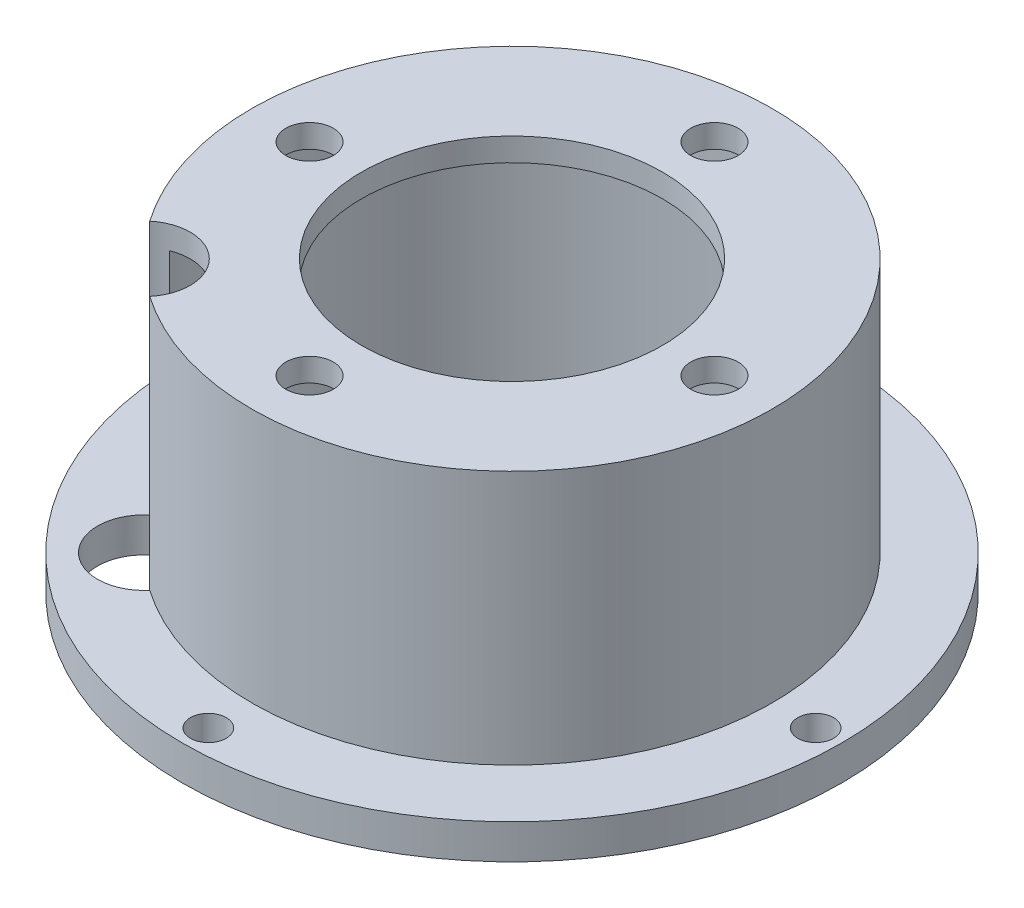
ISO-10303-21;
HEADER;
FILE_DESCRIPTION(('STEP AP214'),'2;1');
FILE_NAME('part.step','',(''),(''),'','','');
FILE_SCHEMA(('AUTOMOTIVE_DESIGN { 1 0 10303 214 1 1 1 1 }'));
ENDSEC;
DATA;
#1=APPLICATION_CONTEXT('core data for automotive mechanical design processes');
#2=APPLICATION_PROTOCOL_DEFINITION('international standard','automotive_design',2000,#1);
#3=PRODUCT_CONTEXT('',#1,'mechanical');
#4=PRODUCT('Part','Part','',(#3));
#5=PRODUCT_RELATED_PRODUCT_CATEGORY('part','',(#4));
#6=PRODUCT_DEFINITION_FORMATION('','',#4);
#7=PRODUCT_DEFINITION_CONTEXT('part definition',#1,'design');
#8=PRODUCT_DEFINITION('design','',#6,#7);
#9=PRODUCT_DEFINITION_SHAPE('','',#8);
#10=(LENGTH_UNIT() NAMED_UNIT(*) SI_UNIT(.MILLI.,.METRE.));
#11=(NAMED_UNIT(*) PLANE_ANGLE_UNIT() SI_UNIT($,.RADIAN.));
#12=(NAMED_UNIT(*) SI_UNIT($,.STERADIAN.) SOLID_ANGLE_UNIT());
#13=UNCERTAINTY_MEASURE_WITH_UNIT(LENGTH_MEASURE(1.E-05),#10,'distance_accuracy_value','');
#14=(GEOMETRIC_REPRESENTATION_CONTEXT(3) GLOBAL_UNCERTAINTY_ASSIGNED_CONTEXT((#13)) GLOBAL_UNIT_ASSIGNED_CONTEXT((#10,
#11,#12)) REPRESENTATION_CONTEXT('',''));
#15=CARTESIAN_POINT('',(0.,0.,0.));
#16=DIRECTION('',(0.,0.,1.));
#17=DIRECTION('',(1.,0.,0.));
#18=AXIS2_PLACEMENT_3D('',#15,#16,#17);
#19=CARTESIAN_POINT('',(0.,25.,-22.5));
#20=DIRECTION('',(0.,1.,0.));
#21=DIRECTION('',(0.,0.,1.));
#22=AXIS2_PLACEMENT_3D('',#19,#20,#21);
#23=PLANE('',#22);
#24=CARTESIAN_POINT('',(-15.9099025766973,25.,15.9099025766973));
#25=DIRECTION('',(0.,1.,0.));
#26=DIRECTION('',(0.,0.,1.));
#27=AXIS2_PLACEMENT_3D('',#24,#25,#26);
#28=CIRCLE('',#27,4.);
#29=CARTESIAN_POINT('',(-12.8412559004105,25.,18.4757177641404));
#30=VERTEX_POINT('',#29);
#31=CARTESIAN_POINT('',(-18.4757177641404,25.,12.8412559004105));
#32=VERTEX_POINT('',#31);
#33=EDGE_CURVE('E76',#30,#32,#28,.T.);
#34=ORIENTED_EDGE('',*,*,#33,.F.);
#35=CARTESIAN_POINT('',(0.,25.,0.));
#36=DIRECTION('',(0.,-1.,0.));
#37=DIRECTION('',(0.,0.,-1.));
#38=AXIS2_PLACEMENT_3D('',#35,#36,#37);
#39=CIRCLE('',#38,22.5);
#40=EDGE_CURVE('E88',#32,#30,#39,.T.);
#41=ORIENTED_EDGE('',*,*,#40,.F.);
#42=EDGE_LOOP('',(#34,#41));
#43=FACE_BOUND('',#42,.T.);
#44=CARTESIAN_POINT('',(0.,25.,-17.5000000000001));
#45=DIRECTION('',(0.,1.,0.));
#46=DIRECTION('',(0.,0.,1.));
#47=AXIS2_PLACEMENT_3D('',#44,#45,#46);
#48=CIRCLE('',#47,2.05);
#49=CARTESIAN_POINT('',(0.,25.,-15.4500000000001));
#50=VERTEX_POINT('',#49);
#51=EDGE_CURVE('E124',#50,#50,#48,.T.);
#52=ORIENTED_EDGE('',*,*,#51,.F.);
#53=EDGE_LOOP('',(#52));
#54=FACE_BOUND('',#53,.T.);
#55=CARTESIAN_POINT('',(17.5,25.,0.));
#56=DIRECTION('',(0.,1.,0.));
#57=DIRECTION('',(0.,0.,1.));
#58=AXIS2_PLACEMENT_3D('',#55,#56,#57);
#59=CIRCLE('',#58,2.05);
#60=CARTESIAN_POINT('',(17.5,25.,2.05));
#61=VERTEX_POINT('',#60);
#62=EDGE_CURVE('E149',#61,#61,#59,.T.);
#63=ORIENTED_EDGE('',*,*,#62,.F.);
#64=EDGE_LOOP('',(#63));
#65=FACE_BOUND('',#64,.T.);
#66=CARTESIAN_POINT('',(0.,25.,17.5));
#67=DIRECTION('',(0.,1.,0.));
#68=DIRECTION('',(0.,0.,1.));
#69=AXIS2_PLACEMENT_3D('',#66,#67,#68);
#70=CIRCLE('',#69,2.05);
#71=CARTESIAN_POINT('',(0.,25.,19.55));
#72=VERTEX_POINT('',#71);
#73=EDGE_CURVE('E141',#72,#72,#70,.T.);
#74=ORIENTED_EDGE('',*,*,#73,.F.);
#75=EDGE_LOOP('',(#74));
#76=FACE_BOUND('',#75,.T.);
#77=CARTESIAN_POINT('',(-17.5000000000001,25.,0.));
#78=DIRECTION('',(0.,1.,0.));
#79=DIRECTION('',(0.,0.,1.));
#80=AXIS2_PLACEMENT_3D('',#77,#78,#79);
#81=CIRCLE('',#80,2.05);
#82=CARTESIAN_POINT('',(-17.5000000000001,25.,2.05));
#83=VERTEX_POINT('',#82);
#84=EDGE_CURVE('E99',#83,#83,#81,.T.);
#85=ORIENTED_EDGE('',*,*,#84,.F.);
#86=EDGE_LOOP('',(#85));
#87=FACE_BOUND('',#86,.T.);
#88=CARTESIAN_POINT('',(0.,25.,0.));
#89=DIRECTION('',(0.,-1.,0.));
#90=DIRECTION('',(0.,0.,-1.));
#91=AXIS2_PLACEMENT_3D('',#88,#89,#90);
#92=CIRCLE('',#91,13.);
#93=CARTESIAN_POINT('',(0.,25.,-13.));
#94=VERTEX_POINT('',#93);
#95=EDGE_CURVE('E85',#94,#94,#92,.T.);
#96=ORIENTED_EDGE('',*,*,#95,.T.);
#97=EDGE_LOOP('',(#96));
#98=FACE_BOUND('',#97,.T.);
#99=ADVANCED_FACE('F37',(#43,#54,#65,#76,#87,#98),#23,.T.);
#100=CARTESIAN_POINT('',(0.,0.,0.));
#101=DIRECTION('',(0.,-1.,0.));
#102=DIRECTION('',(0.,0.,-1.));
#103=AXIS2_PLACEMENT_3D('',#100,#101,#102);
#104=CYLINDRICAL_SURFACE('',#103,13.);
#105=CARTESIAN_POINT('',(0.,23.,0.));
#106=DIRECTION('',(0.,-1.,0.));
#107=DIRECTION('',(0.,0.,-1.));
#108=AXIS2_PLACEMENT_3D('',#105,#106,#107);
#109=CIRCLE('',#108,13.);
#110=CARTESIAN_POINT('',(0.,23.,-13.));
#111=VERTEX_POINT('',#110);
#112=EDGE_CURVE('E112',#111,#111,#109,.T.);
#113=ORIENTED_EDGE('',*,*,#112,.T.);
#114=EDGE_LOOP('',(#113));
#115=FACE_BOUND('',#114,.T.);
#116=ORIENTED_EDGE('',*,*,#95,.F.);
#117=EDGE_LOOP('',(#116));
#118=FACE_BOUND('',#117,.T.);
#119=ADVANCED_FACE('F210',(#115,#118),#104,.F.);
#120=CARTESIAN_POINT('',(0.,23.,-13.));
#121=DIRECTION('',(0.,-1.,0.));
#122=DIRECTION('',(0.,0.,-1.));
#123=AXIS2_PLACEMENT_3D('',#120,#121,#122);
#124=PLANE('',#123);
#125=CARTESIAN_POINT('',(-15.9099025766973,23.,15.9099025766973));
#126=DIRECTION('',(0.,-1.,0.));
#127=DIRECTION('',(0.,0.,-1.));
#128=AXIS2_PLACEMENT_3D('',#125,#126,#127);
#129=CIRCLE('',#128,4.);
#130=CARTESIAN_POINT('',(-17.4003556514104,23.,12.1979556977565));
#131=VERTEX_POINT('',#130);
#132=CARTESIAN_POINT('',(-12.1979556977565,23.,17.4003556514104));
#133=VERTEX_POINT('',#132);
#134=EDGE_CURVE('E158',#131,#133,#129,.T.);
#135=ORIENTED_EDGE('',*,*,#134,.F.);
#136=CARTESIAN_POINT('',(0.,23.,0.));
#137=DIRECTION('',(0.,-1.,0.));
#138=DIRECTION('',(0.,0.,-1.));
#139=AXIS2_PLACEMENT_3D('',#136,#137,#138);
#140=CIRCLE('',#139,21.25);
#141=EDGE_CURVE('E111',#131,#133,#140,.T.);
#142=ORIENTED_EDGE('',*,*,#141,.T.);
#143=EDGE_LOOP('',(#135,#142));
#144=FACE_BOUND('',#143,.T.);
#145=CARTESIAN_POINT('',(0.,23.,-17.5000000000001));
#146=DIRECTION('',(0.,-1.,0.));
#147=DIRECTION('',(0.,0.,-1.));
#148=AXIS2_PLACEMENT_3D('',#145,#146,#147);
#149=CIRCLE('',#148,2.05);
#150=CARTESIAN_POINT('',(0.,23.,-19.5500000000001));
#151=VERTEX_POINT('',#150);
#152=EDGE_CURVE('E91',#151,#151,#149,.T.);
#153=ORIENTED_EDGE('',*,*,#152,.F.);
#154=EDGE_LOOP('',(#153));
#155=FACE_BOUND('',#154,.T.);
#156=CARTESIAN_POINT('',(17.5,23.,0.));
#157=DIRECTION('',(0.,-1.,0.));
#158=DIRECTION('',(0.,0.,-1.));
#159=AXIS2_PLACEMENT_3D('',#156,#157,#158);
#160=CIRCLE('',#159,2.05);
#161=CARTESIAN_POINT('',(17.5,23.,-2.05));
#162=VERTEX_POINT('',#161);
#163=EDGE_CURVE('E97',#162,#162,#160,.T.);
#164=ORIENTED_EDGE('',*,*,#163,.F.);
#165=EDGE_LOOP('',(#164));
#166=FACE_BOUND('',#165,.T.);
#167=CARTESIAN_POINT('',(0.,23.,17.5));
#168=DIRECTION('',(0.,-1.,0.));
#169=DIRECTION('',(0.,0.,-1.));
#170=AXIS2_PLACEMENT_3D('',#167,#168,#169);
#171=CIRCLE('',#170,2.05);
#172=CARTESIAN_POINT('',(0.,23.,15.45));
#173=VERTEX_POINT('',#172);
#174=EDGE_CURVE('E125',#173,#173,#171,.T.);
#175=ORIENTED_EDGE('',*,*,#174,.F.);
#176=EDGE_LOOP('',(#175));
#177=FACE_BOUND('',#176,.T.);
#178=CARTESIAN_POINT('',(-17.5000000000001,23.,0.));
#179=DIRECTION('',(0.,-1.,0.));
#180=DIRECTION('',(0.,0.,-1.));
#181=AXIS2_PLACEMENT_3D('',#178,#179,#180);
#182=CIRCLE('',#181,2.05);
#183=CARTESIAN_POINT('',(-17.5000000000001,23.,-2.05));
#184=VERTEX_POINT('',#183);
#185=EDGE_CURVE('E118',#184,#184,#182,.T.);
#186=ORIENTED_EDGE('',*,*,#185,.F.);
#187=EDGE_LOOP('',(#186));
#188=FACE_BOUND('',#187,.T.);
#189=ORIENTED_EDGE('',*,*,#112,.F.);
#190=EDGE_LOOP('',(#189));
#191=FACE_BOUND('',#190,.T.);
#192=ADVANCED_FACE('F214',(#144,#155,#166,#177,#188,#191),#124,.T.);
#193=CARTESIAN_POINT('',(0.,0.,0.));
#194=DIRECTION('',(0.,-1.,0.));
#195=DIRECTION('',(0.,0.,-1.));
#196=AXIS2_PLACEMENT_3D('',#193,#194,#195);
#197=CYLINDRICAL_SURFACE('',#196,21.25);
#198=DIRECTION('',(0.,1.,0.));
#199=VECTOR('',#198,1.);
#200=CARTESIAN_POINT('',(-17.4003556514104,10.5,12.1979556977565));
#201=LINE('',#200,#199);
#202=CARTESIAN_POINT('',(-17.4003556514104,0.,12.1979556977565));
#203=VERTEX_POINT('',#202);
#204=EDGE_CURVE('E166',#203,#131,#201,.T.);
#205=ORIENTED_EDGE('',*,*,#204,.F.);
#206=CARTESIAN_POINT('',(0.,0.,0.));
#207=DIRECTION('',(0.,-1.,0.));
#208=DIRECTION('',(0.,0.,-1.));
#209=AXIS2_PLACEMENT_3D('',#206,#207,#208);
#210=CIRCLE('',#209,21.25);
#211=CARTESIAN_POINT('',(-12.1979556977565,0.,17.4003556514104));
#212=VERTEX_POINT('',#211);
#213=EDGE_CURVE('E108',#203,#212,#210,.T.);
#214=ORIENTED_EDGE('',*,*,#213,.T.);
#215=DIRECTION('',(0.,1.,0.));
#216=VECTOR('',#215,1.);
#217=CARTESIAN_POINT('',(-12.1979556977565,10.5,17.4003556514104));
#218=LINE('',#217,#216);
#219=EDGE_CURVE('E53',#133,#212,#218,.F.);
#220=ORIENTED_EDGE('',*,*,#219,.F.);
#221=ORIENTED_EDGE('',*,*,#141,.F.);
#222=EDGE_LOOP('',(#205,#214,#220,#221));
#223=FACE_BOUND('',#222,.T.);
#224=ADVANCED_FACE('F177',(#223),#197,.F.);
#225=CARTESIAN_POINT('',(0.,0.,-21.25));
#226=DIRECTION('',(0.,-1.,0.));
#227=DIRECTION('',(0.,0.,-1.));
#228=AXIS2_PLACEMENT_3D('',#225,#226,#227);
#229=PLANE('',#228);
#230=CARTESIAN_POINT('',(-15.9099025766973,0.,15.9099025766973));
#231=DIRECTION('',(0.,-1.,0.));
#232=DIRECTION('',(0.,0.,-1.));
#233=AXIS2_PLACEMENT_3D('',#230,#231,#232);
#234=CIRCLE('',#233,4.);
#235=EDGE_CURVE('E171',#212,#203,#234,.T.);
#236=ORIENTED_EDGE('',*,*,#235,.F.);
#237=ORIENTED_EDGE('',*,*,#213,.F.);
#238=EDGE_LOOP('',(#236,#237));
#239=FACE_BOUND('',#238,.T.);
#240=CARTESIAN_POINT('',(0.,0.,26.25));
#241=DIRECTION('',(0.,1.,0.));
#242=DIRECTION('',(0.,0.,1.));
#243=AXIS2_PLACEMENT_3D('',#240,#241,#242);
#244=CIRCLE('',#243,1.55);
#245=CARTESIAN_POINT('',(0.,0.,27.8));
#246=VERTEX_POINT('',#245);
#247=EDGE_CURVE('E135',#246,#246,#244,.T.);
#248=ORIENTED_EDGE('',*,*,#247,.T.);
#249=EDGE_LOOP('',(#248));
#250=FACE_BOUND('',#249,.T.);
#251=CARTESIAN_POINT('',(-26.25,0.,0.));
#252=DIRECTION('',(0.,1.,0.));
#253=DIRECTION('',(0.,0.,1.));
#254=AXIS2_PLACEMENT_3D('',#251,#252,#253);
#255=CIRCLE('',#254,1.55);
#256=CARTESIAN_POINT('',(-26.25,0.,1.54999999999991));
#257=VERTEX_POINT('',#256);
#258=EDGE_CURVE('E162',#257,#257,#255,.T.);
#259=ORIENTED_EDGE('',*,*,#258,.T.);
#260=EDGE_LOOP('',(#259));
#261=FACE_BOUND('',#260,.T.);
#262=CARTESIAN_POINT('',(1.83302770289264E-13,0.,-26.25));
#263=DIRECTION('',(0.,1.,0.));
#264=DIRECTION('',(0.,0.,1.));
#265=AXIS2_PLACEMENT_3D('',#262,#263,#264);
#266=CIRCLE('',#265,1.55);
#267=CARTESIAN_POINT('',(1.83302770289264E-13,0.,-24.7));
#268=VERTEX_POINT('',#267);
#269=EDGE_CURVE('E160',#268,#268,#266,.T.);
#270=ORIENTED_EDGE('',*,*,#269,.T.);
#271=EDGE_LOOP('',(#270));
#272=FACE_BOUND('',#271,.T.);
#273=CARTESIAN_POINT('',(26.25,0.,2.74954155433897E-13));
#274=DIRECTION('',(0.,1.,0.));
#275=DIRECTION('',(0.,0.,1.));
#276=AXIS2_PLACEMENT_3D('',#273,#274,#275);
#277=CIRCLE('',#276,1.55);
#278=CARTESIAN_POINT('',(26.25,0.,1.55000000000028));
#279=VERTEX_POINT('',#278);
#280=EDGE_CURVE('E154',#279,#279,#277,.T.);
#281=ORIENTED_EDGE('',*,*,#280,.T.);
#282=EDGE_LOOP('',(#281));
#283=FACE_BOUND('',#282,.T.);
#284=CARTESIAN_POINT('',(0.,0.,0.));
#285=DIRECTION('',(0.,-1.,0.));
#286=DIRECTION('',(0.,0.,-1.));
#287=AXIS2_PLACEMENT_3D('',#284,#285,#286);
#288=CIRCLE('',#287,28.5);
#289=CARTESIAN_POINT('',(0.,0.,-28.5));
#290=VERTEX_POINT('',#289);
#291=EDGE_CURVE('E102',#290,#290,#288,.T.);
#292=ORIENTED_EDGE('',*,*,#291,.T.);
#293=EDGE_LOOP('',(#292));
#294=FACE_BOUND('',#293,.T.);
#295=ADVANCED_FACE('F179',(#239,#250,#261,#272,#283,#294),#229,.T.);
#296=CARTESIAN_POINT('',(0.,0.,0.));
#297=DIRECTION('',(0.,-1.,0.));
#298=DIRECTION('',(0.,0.,-1.));
#299=AXIS2_PLACEMENT_3D('',#296,#297,#298);
#300=CYLINDRICAL_SURFACE('',#299,28.5);
#301=CARTESIAN_POINT('',(0.,3.,0.));
#302=DIRECTION('',(0.,-1.,0.));
#303=DIRECTION('',(0.,0.,-1.));
#304=AXIS2_PLACEMENT_3D('',#301,#302,#303);
#305=CIRCLE('',#304,28.5);
#306=CARTESIAN_POINT('',(0.,3.,-28.5));
#307=VERTEX_POINT('',#306);
#308=EDGE_CURVE('E93',#307,#307,#305,.T.);
#309=ORIENTED_EDGE('',*,*,#308,.T.);
#310=EDGE_LOOP('',(#309));
#311=FACE_BOUND('',#310,.T.);
#312=ORIENTED_EDGE('',*,*,#291,.F.);
#313=EDGE_LOOP('',(#312));
#314=FACE_BOUND('',#313,.T.);
#315=ADVANCED_FACE('F182',(#311,#314),#300,.T.);
#316=CARTESIAN_POINT('',(0.,3.,-28.5));
#317=DIRECTION('',(0.,1.,0.));
#318=DIRECTION('',(0.,0.,1.));
#319=AXIS2_PLACEMENT_3D('',#316,#317,#318);
#320=PLANE('',#319);
#321=CARTESIAN_POINT('',(-15.9099025766973,3.,15.9099025766973));
#322=DIRECTION('',(0.,1.,0.));
#323=DIRECTION('',(0.,0.,1.));
#324=AXIS2_PLACEMENT_3D('',#321,#322,#323);
#325=CIRCLE('',#324,4.);
#326=CARTESIAN_POINT('',(-18.4757177641404,3.,12.8412559004105));
#327=VERTEX_POINT('',#326);
#328=CARTESIAN_POINT('',(-12.8412559004105,3.,18.4757177641404));
#329=VERTEX_POINT('',#328);
#330=EDGE_CURVE('E63',#327,#329,#325,.T.);
#331=ORIENTED_EDGE('',*,*,#330,.F.);
#332=CARTESIAN_POINT('',(0.,3.,0.));
#333=DIRECTION('',(0.,-1.,0.));
#334=DIRECTION('',(0.,0.,-1.));
#335=AXIS2_PLACEMENT_3D('',#332,#333,#334);
#336=CIRCLE('',#335,22.5);
#337=EDGE_CURVE('E94',#327,#329,#336,.T.);
#338=ORIENTED_EDGE('',*,*,#337,.T.);
#339=EDGE_LOOP('',(#331,#338));
#340=FACE_BOUND('',#339,.T.);
#341=CARTESIAN_POINT('',(0.,3.,26.25));
#342=DIRECTION('',(0.,1.,0.));
#343=DIRECTION('',(0.,0.,1.));
#344=AXIS2_PLACEMENT_3D('',#341,#342,#343);
#345=CIRCLE('',#344,1.55);
#346=CARTESIAN_POINT('',(0.,3.,27.8));
#347=VERTEX_POINT('',#346);
#348=EDGE_CURVE('E140',#347,#347,#345,.F.);
#349=ORIENTED_EDGE('',*,*,#348,.T.);
#350=EDGE_LOOP('',(#349));
#351=FACE_BOUND('',#350,.T.);
#352=CARTESIAN_POINT('',(-26.25,3.,0.));
#353=DIRECTION('',(0.,1.,0.));
#354=DIRECTION('',(0.,0.,1.));
#355=AXIS2_PLACEMENT_3D('',#352,#353,#354);
#356=CIRCLE('',#355,1.55);
#357=CARTESIAN_POINT('',(-26.25,3.,1.54999999999991));
#358=VERTEX_POINT('',#357);
#359=EDGE_CURVE('E134',#358,#358,#356,.F.);
#360=ORIENTED_EDGE('',*,*,#359,.T.);
#361=EDGE_LOOP('',(#360));
#362=FACE_BOUND('',#361,.T.);
#363=CARTESIAN_POINT('',(1.83302770289264E-13,3.,-26.25));
#364=DIRECTION('',(0.,1.,0.));
#365=DIRECTION('',(0.,0.,1.));
#366=AXIS2_PLACEMENT_3D('',#363,#364,#365);
#367=CIRCLE('',#366,1.55);
#368=CARTESIAN_POINT('',(1.83302770289264E-13,3.,-24.7));
#369=VERTEX_POINT('',#368);
#370=EDGE_CURVE('E131',#369,#369,#367,.F.);
#371=ORIENTED_EDGE('',*,*,#370,.T.);
#372=EDGE_LOOP('',(#371));
#373=FACE_BOUND('',#372,.T.);
#374=CARTESIAN_POINT('',(26.25,3.,2.74954155433897E-13));
#375=DIRECTION('',(0.,1.,0.));
#376=DIRECTION('',(0.,0.,1.));
#377=AXIS2_PLACEMENT_3D('',#374,#375,#376);
#378=CIRCLE('',#377,1.55);
#379=CARTESIAN_POINT('',(26.25,3.,1.55000000000028));
#380=VERTEX_POINT('',#379);
#381=EDGE_CURVE('E127',#380,#380,#378,.F.);
#382=ORIENTED_EDGE('',*,*,#381,.T.);
#383=EDGE_LOOP('',(#382));
#384=FACE_BOUND('',#383,.T.);
#385=ORIENTED_EDGE('',*,*,#308,.F.);
#386=EDGE_LOOP('',(#385));
#387=FACE_BOUND('',#386,.T.);
#388=ADVANCED_FACE('F196',(#340,#351,#362,#373,#384,#387),#320,.T.);
#389=CARTESIAN_POINT('',(0.,0.,0.));
#390=DIRECTION('',(0.,-1.,0.));
#391=DIRECTION('',(0.,0.,-1.));
#392=AXIS2_PLACEMENT_3D('',#389,#390,#391);
#393=CYLINDRICAL_SURFACE('',#392,22.5);
#394=DIRECTION('',(0.,1.,0.));
#395=VECTOR('',#394,1.);
#396=CARTESIAN_POINT('',(-18.4757177641404,10.5,12.8412559004105));
#397=LINE('',#396,#395);
#398=EDGE_CURVE('E11',#32,#327,#397,.F.);
#399=ORIENTED_EDGE('',*,*,#398,.F.);
#400=ORIENTED_EDGE('',*,*,#40,.T.);
#401=DIRECTION('',(0.,1.,0.));
#402=VECTOR('',#401,1.);
#403=CARTESIAN_POINT('',(-12.8412559004105,10.5,18.4757177641404));
#404=LINE('',#403,#402);
#405=EDGE_CURVE('E50',#329,#30,#404,.T.);
#406=ORIENTED_EDGE('',*,*,#405,.F.);
#407=ORIENTED_EDGE('',*,*,#337,.F.);
#408=EDGE_LOOP('',(#399,#400,#406,#407));
#409=FACE_BOUND('',#408,.T.);
#410=ADVANCED_FACE('F89',(#409),#393,.T.);
#411=CARTESIAN_POINT('',(-17.5000000000001,15.,0.));
#412=DIRECTION('',(0.,1.,0.));
#413=DIRECTION('',(0.,0.,1.));
#414=AXIS2_PLACEMENT_3D('',#411,#412,#413);
#415=CYLINDRICAL_SURFACE('',#414,2.05);
#416=ORIENTED_EDGE('',*,*,#185,.T.);
#417=EDGE_LOOP('',(#416));
#418=FACE_BOUND('',#417,.T.);
#419=ORIENTED_EDGE('',*,*,#84,.T.);
#420=EDGE_LOOP('',(#419));
#421=FACE_BOUND('',#420,.T.);
#422=ADVANCED_FACE('F245',(#418,#421),#415,.F.);
#423=CARTESIAN_POINT('',(0.,15.,17.5));
#424=DIRECTION('',(0.,1.,0.));
#425=DIRECTION('',(0.,0.,1.));
#426=AXIS2_PLACEMENT_3D('',#423,#424,#425);
#427=CYLINDRICAL_SURFACE('',#426,2.05);
#428=ORIENTED_EDGE('',*,*,#174,.T.);
#429=EDGE_LOOP('',(#428));
#430=FACE_BOUND('',#429,.T.);
#431=ORIENTED_EDGE('',*,*,#73,.T.);
#432=EDGE_LOOP('',(#431));
#433=FACE_BOUND('',#432,.T.);
#434=ADVANCED_FACE('F311',(#430,#433),#427,.F.);
#435=CARTESIAN_POINT('',(17.5,15.,0.));
#436=DIRECTION('',(0.,1.,0.));
#437=DIRECTION('',(0.,0.,1.));
#438=AXIS2_PLACEMENT_3D('',#435,#436,#437);
#439=CYLINDRICAL_SURFACE('',#438,2.05);
#440=ORIENTED_EDGE('',*,*,#163,.T.);
#441=EDGE_LOOP('',(#440));
#442=FACE_BOUND('',#441,.T.);
#443=ORIENTED_EDGE('',*,*,#62,.T.);
#444=EDGE_LOOP('',(#443));
#445=FACE_BOUND('',#444,.T.);
#446=ADVANCED_FACE('F301',(#442,#445),#439,.F.);
#447=CARTESIAN_POINT('',(0.,15.,-17.5000000000001));
#448=DIRECTION('',(0.,1.,0.));
#449=DIRECTION('',(0.,0.,1.));
#450=AXIS2_PLACEMENT_3D('',#447,#448,#449);
#451=CYLINDRICAL_SURFACE('',#450,2.05);
#452=ORIENTED_EDGE('',*,*,#152,.T.);
#453=EDGE_LOOP('',(#452));
#454=FACE_BOUND('',#453,.T.);
#455=ORIENTED_EDGE('',*,*,#51,.T.);
#456=EDGE_LOOP('',(#455));
#457=FACE_BOUND('',#456,.T.);
#458=ADVANCED_FACE('F293',(#454,#457),#451,.F.);
#459=CARTESIAN_POINT('',(26.25,25.,2.74954155433897E-13));
#460=DIRECTION('',(0.,-1.,0.));
#461=DIRECTION('',(0.,0.,-1.));
#462=AXIS2_PLACEMENT_3D('',#459,#460,#461);
#463=CYLINDRICAL_SURFACE('',#462,1.55);
#464=ORIENTED_EDGE('',*,*,#381,.F.);
#465=EDGE_LOOP('',(#464));
#466=FACE_BOUND('',#465,.T.);
#467=ORIENTED_EDGE('',*,*,#280,.F.);
#468=EDGE_LOOP('',(#467));
#469=FACE_BOUND('',#468,.T.);
#470=ADVANCED_FACE('F281',(#466,#469),#463,.F.);
#471=CARTESIAN_POINT('',(1.83302770289264E-13,25.,-26.25));
#472=DIRECTION('',(0.,-1.,0.));
#473=DIRECTION('',(0.,0.,-1.));
#474=AXIS2_PLACEMENT_3D('',#471,#472,#473);
#475=CYLINDRICAL_SURFACE('',#474,1.55);
#476=ORIENTED_EDGE('',*,*,#370,.F.);
#477=EDGE_LOOP('',(#476));
#478=FACE_BOUND('',#477,.T.);
#479=ORIENTED_EDGE('',*,*,#269,.F.);
#480=EDGE_LOOP('',(#479));
#481=FACE_BOUND('',#480,.T.);
#482=ADVANCED_FACE('F272',(#478,#481),#475,.F.);
#483=CARTESIAN_POINT('',(-26.25,25.,0.));
#484=DIRECTION('',(0.,-1.,0.));
#485=DIRECTION('',(0.,0.,-1.));
#486=AXIS2_PLACEMENT_3D('',#483,#484,#485);
#487=CYLINDRICAL_SURFACE('',#486,1.55);
#488=ORIENTED_EDGE('',*,*,#359,.F.);
#489=EDGE_LOOP('',(#488));
#490=FACE_BOUND('',#489,.T.);
#491=ORIENTED_EDGE('',*,*,#258,.F.);
#492=EDGE_LOOP('',(#491));
#493=FACE_BOUND('',#492,.T.);
#494=ADVANCED_FACE('F261',(#490,#493),#487,.F.);
#495=CARTESIAN_POINT('',(0.,25.,26.25));
#496=DIRECTION('',(0.,-1.,0.));
#497=DIRECTION('',(0.,0.,-1.));
#498=AXIS2_PLACEMENT_3D('',#495,#496,#497);
#499=CYLINDRICAL_SURFACE('',#498,1.55);
#500=ORIENTED_EDGE('',*,*,#348,.F.);
#501=EDGE_LOOP('',(#500));
#502=FACE_BOUND('',#501,.T.);
#503=ORIENTED_EDGE('',*,*,#247,.F.);
#504=EDGE_LOOP('',(#503));
#505=FACE_BOUND('',#504,.T.);
#506=ADVANCED_FACE('F249',(#502,#505),#499,.F.);
#507=CARTESIAN_POINT('',(-15.9099025766973,-4.00000000000001,15.9099025766973));
#508=DIRECTION('',(0.,1.,0.));
#509=DIRECTION('',(0.,0.,1.));
#510=AXIS2_PLACEMENT_3D('',#507,#508,#509);
#511=CYLINDRICAL_SURFACE('',#510,4.);
#512=ORIENTED_EDGE('',*,*,#134,.T.);
#513=ORIENTED_EDGE('',*,*,#219,.T.);
#514=ORIENTED_EDGE('',*,*,#235,.T.);
#515=ORIENTED_EDGE('',*,*,#204,.T.);
#516=EDGE_LOOP('',(#512,#513,#514,#515));
#517=FACE_BOUND('',#516,.T.);
#518=ORIENTED_EDGE('',*,*,#398,.T.);
#519=ORIENTED_EDGE('',*,*,#330,.T.);
#520=ORIENTED_EDGE('',*,*,#405,.T.);
#521=ORIENTED_EDGE('',*,*,#33,.T.);
#522=EDGE_LOOP('',(#518,#519,#520,#521));
#523=FACE_BOUND('',#522,.T.);
#524=ADVANCED_FACE('F80',(#517,#523),#511,.F.);
#525=CLOSED_SHELL('',(#99,#119,#192,#224,#295,#315,#388,#410,#422,#434,#446,#458,#470,#482,#494,
#506,#524));
#526=MANIFOLD_SOLID_BREP('B2',#525);
#527=ADVANCED_BREP_SHAPE_REPRESENTATION('',(#18,#526),#14);
#528=SHAPE_DEFINITION_REPRESENTATION(#9,#527);
ENDSEC;
END-ISO-10303-21;
